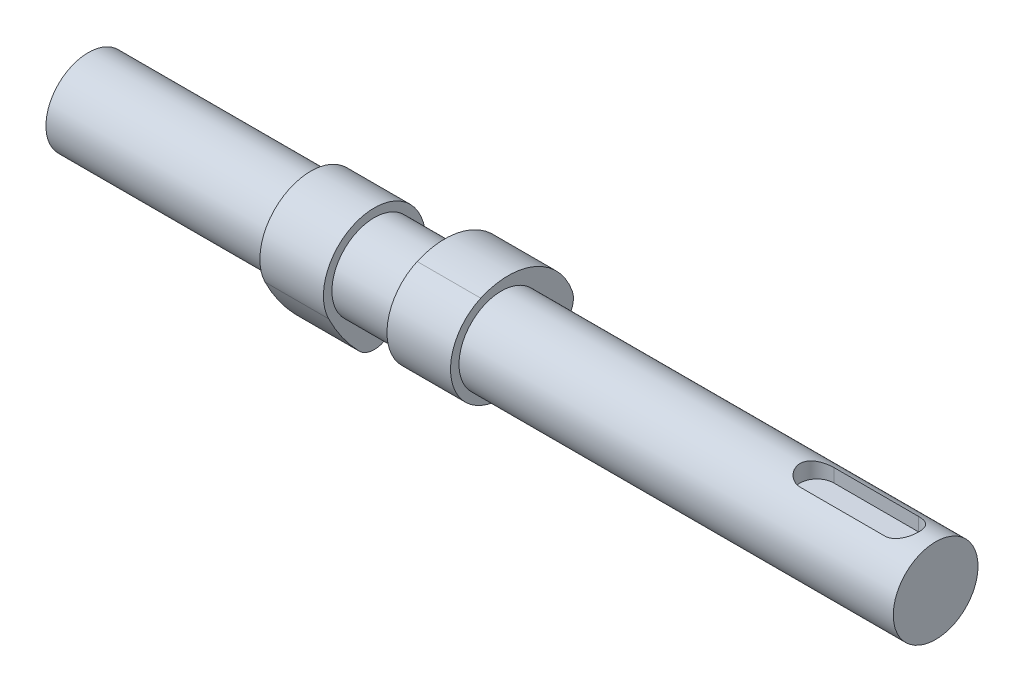
ISO-10303-21;
HEADER;
FILE_DESCRIPTION(('STEP AP214'),'2;1');
FILE_NAME('part.step','',(''),(''),'','','');
FILE_SCHEMA(('AUTOMOTIVE_DESIGN { 1 0 10303 214 1 1 1 1 }'));
ENDSEC;
DATA;
#1=APPLICATION_CONTEXT('core data for automotive mechanical design processes');
#2=APPLICATION_PROTOCOL_DEFINITION('international standard','automotive_design',2000,#1);
#3=PRODUCT_CONTEXT('',#1,'mechanical');
#4=PRODUCT('Part','Part','',(#3));
#5=PRODUCT_RELATED_PRODUCT_CATEGORY('part','',(#4));
#6=PRODUCT_DEFINITION_FORMATION('','',#4);
#7=PRODUCT_DEFINITION_CONTEXT('part definition',#1,'design');
#8=PRODUCT_DEFINITION('design','',#6,#7);
#9=PRODUCT_DEFINITION_SHAPE('','',#8);
#10=(LENGTH_UNIT() NAMED_UNIT(*) SI_UNIT(.MILLI.,.METRE.));
#11=(NAMED_UNIT(*) PLANE_ANGLE_UNIT() SI_UNIT($,.RADIAN.));
#12=(NAMED_UNIT(*) SI_UNIT($,.STERADIAN.) SOLID_ANGLE_UNIT());
#13=UNCERTAINTY_MEASURE_WITH_UNIT(LENGTH_MEASURE(1.E-05),#10,'distance_accuracy_value','');
#14=(GEOMETRIC_REPRESENTATION_CONTEXT(3) GLOBAL_UNCERTAINTY_ASSIGNED_CONTEXT((#13)) GLOBAL_UNIT_ASSIGNED_CONTEXT((#10,
#11,#12)) REPRESENTATION_CONTEXT('',''));
#15=CARTESIAN_POINT('',(0.,0.,0.));
#16=DIRECTION('',(0.,0.,1.));
#17=DIRECTION('',(1.,0.,0.));
#18=AXIS2_PLACEMENT_3D('',#15,#16,#17);
#19=CARTESIAN_POINT('',(-22.5,-1.62236318948023,3.65621904177246));
#20=DIRECTION('',(1.,0.,0.));
#21=DIRECTION('',(0.,1.,0.));
#22=AXIS2_PLACEMENT_3D('',#19,#20,#21);
#23=CYLINDRICAL_SURFACE('',#22,16.);
#24=CARTESIAN_POINT('',(-7.5,-1.62236318948023,3.65621904177246));
#25=DIRECTION('',(1.,0.,0.));
#26=DIRECTION('',(0.,1.,0.));
#27=AXIS2_PLACEMENT_3D('',#24,#25,#26);
#28=CIRCLE('',#27,16.);
#29=CARTESIAN_POINT('',(-7.5,-16.7126720366766,-1.66191774626015));
#30=VERTEX_POINT('',#29);
#31=CARTESIAN_POINT('',(-7.5,4.86708956844069,-10.9686571253174));
#32=VERTEX_POINT('',#31);
#33=EDGE_CURVE('E113',#30,#32,#28,.T.);
#34=ORIENTED_EDGE('',*,*,#33,.F.);
#35=DIRECTION('',(1.,0.,0.));
#36=VECTOR('',#35,1.);
#37=CARTESIAN_POINT('',(-22.5,-16.7126720366766,-1.66191774626015));
#38=LINE('',#37,#36);
#39=CARTESIAN_POINT('',(-22.5,-16.7126720366766,-1.66191774626015));
#40=VERTEX_POINT('',#39);
#41=EDGE_CURVE('E112',#40,#30,#38,.T.);
#42=ORIENTED_EDGE('',*,*,#41,.F.);
#43=CARTESIAN_POINT('',(-22.5,-1.62236318948023,3.65621904177246));
#44=DIRECTION('',(1.,0.,0.));
#45=DIRECTION('',(0.,1.,0.));
#46=AXIS2_PLACEMENT_3D('',#43,#44,#45);
#47=CIRCLE('',#46,16.);
#48=CARTESIAN_POINT('',(-22.5,4.86708956844069,-10.9686571253174));
#49=VERTEX_POINT('',#48);
#50=EDGE_CURVE('E107',#40,#49,#47,.T.);
#51=ORIENTED_EDGE('',*,*,#50,.T.);
#52=DIRECTION('',(1.,0.,0.));
#53=VECTOR('',#52,1.);
#54=CARTESIAN_POINT('',(-22.5,4.86708956844069,-10.9686571253174));
#55=LINE('',#54,#53);
#56=EDGE_CURVE('E12',#49,#32,#55,.T.);
#57=ORIENTED_EDGE('',*,*,#56,.T.);
#58=EDGE_LOOP('',(#34,#42,#51,#57));
#59=FACE_BOUND('',#58,.T.);
#60=ADVANCED_FACE('F50',(#59),#23,.T.);
#61=CARTESIAN_POINT('',(-22.5,0.,0.));
#62=DIRECTION('',(1.,0.,0.));
#63=DIRECTION('',(0.,1.,0.));
#64=AXIS2_PLACEMENT_3D('',#61,#62,#63);
#65=CYLINDRICAL_SURFACE('',#64,12.);
#66=CARTESIAN_POINT('',(-7.5,0.,0.));
#67=DIRECTION('',(1.,0.,0.));
#68=DIRECTION('',(0.,-1.,0.));
#69=AXIS2_PLACEMENT_3D('',#66,#67,#68);
#70=CIRCLE('',#69,12.);
#71=CARTESIAN_POINT('',(-7.5,-5.30622661682886,10.7630831591537));
#72=VERTEX_POINT('',#71);
#73=EDGE_CURVE('E115',#32,#72,#70,.T.);
#74=ORIENTED_EDGE('',*,*,#73,.F.);
#75=ORIENTED_EDGE('',*,*,#56,.F.);
#76=CARTESIAN_POINT('',(-22.5,0.,0.));
#77=DIRECTION('',(1.,0.,0.));
#78=DIRECTION('',(0.,-1.,0.));
#79=AXIS2_PLACEMENT_3D('',#76,#77,#78);
#80=CIRCLE('',#79,12.);
#81=CARTESIAN_POINT('',(-22.5,-5.30622661682886,10.7630831591537));
#82=VERTEX_POINT('',#81);
#83=EDGE_CURVE('E91',#49,#82,#80,.T.);
#84=ORIENTED_EDGE('',*,*,#83,.T.);
#85=DIRECTION('',(1.,0.,0.));
#86=VECTOR('',#85,1.);
#87=CARTESIAN_POINT('',(-22.5,-5.30622661682886,10.7630831591537));
#88=LINE('',#87,#86);
#89=EDGE_CURVE('E58',#82,#72,#88,.T.);
#90=ORIENTED_EDGE('',*,*,#89,.T.);
#91=EDGE_LOOP('',(#74,#75,#84,#90));
#92=FACE_BOUND('',#91,.T.);
#93=ADVANCED_FACE('F105',(#92),#65,.T.);
#94=CARTESIAN_POINT('',(-22.5,12.3811954392673,-25.1138607046919));
#95=DIRECTION('',(1.,0.,0.));
#96=DIRECTION('',(0.,1.,0.));
#97=AXIS2_PLACEMENT_3D('',#94,#95,#96);
#98=CYLINDRICAL_SURFACE('',#97,40.);
#99=CARTESIAN_POINT('',(-7.5,12.3811954392673,-25.1138607046919));
#100=DIRECTION('',(1.,0.,0.));
#101=DIRECTION('',(0.,-1.,0.));
#102=AXIS2_PLACEMENT_3D('',#99,#100,#101);
#103=CIRCLE('',#102,40.);
#104=CARTESIAN_POINT('',(-7.5,-15.4795428020985,3.5876943863846));
#105=VERTEX_POINT('',#104);
#106=EDGE_CURVE('E101',#72,#105,#103,.T.);
#107=ORIENTED_EDGE('',*,*,#106,.F.);
#108=ORIENTED_EDGE('',*,*,#89,.F.);
#109=CARTESIAN_POINT('',(-22.5,12.3811954392673,-25.1138607046919));
#110=DIRECTION('',(1.,0.,0.));
#111=DIRECTION('',(0.,-1.,0.));
#112=AXIS2_PLACEMENT_3D('',#109,#110,#111);
#113=CIRCLE('',#112,40.);
#114=CARTESIAN_POINT('',(-22.5,-15.4795428020985,3.5876943863846));
#115=VERTEX_POINT('',#114);
#116=EDGE_CURVE('E94',#82,#115,#113,.T.);
#117=ORIENTED_EDGE('',*,*,#116,.T.);
#118=DIRECTION('',(1.,0.,0.));
#119=VECTOR('',#118,1.);
#120=CARTESIAN_POINT('',(-22.5,-15.4795428020985,3.5876943863846));
#121=LINE('',#120,#119);
#122=EDGE_CURVE('E104',#115,#105,#121,.T.);
#123=ORIENTED_EDGE('',*,*,#122,.T.);
#124=EDGE_LOOP('',(#107,#108,#117,#123));
#125=FACE_BOUND('',#124,.T.);
#126=ADVANCED_FACE('F100',(#125),#98,.T.);
#127=CARTESIAN_POINT('',(-22.5,-11.9969505219278,0.));
#128=DIRECTION('',(1.,0.,0.));
#129=DIRECTION('',(0.,1.,0.));
#130=AXIS2_PLACEMENT_3D('',#127,#128,#129);
#131=CYLINDRICAL_SURFACE('',#130,5.);
#132=CARTESIAN_POINT('',(-7.5,-11.9969505219278,0.));
#133=DIRECTION('',(1.,0.,0.));
#134=DIRECTION('',(0.,-1.,0.));
#135=AXIS2_PLACEMENT_3D('',#132,#133,#134);
#136=CIRCLE('',#135,5.);
#137=EDGE_CURVE('E80',#105,#30,#136,.T.);
#138=ORIENTED_EDGE('',*,*,#137,.F.);
#139=ORIENTED_EDGE('',*,*,#122,.F.);
#140=CARTESIAN_POINT('',(-22.5,-11.9969505219278,0.));
#141=DIRECTION('',(1.,0.,0.));
#142=DIRECTION('',(0.,-1.,0.));
#143=AXIS2_PLACEMENT_3D('',#140,#141,#142);
#144=CIRCLE('',#143,5.);
#145=EDGE_CURVE('E66',#115,#40,#144,.T.);
#146=ORIENTED_EDGE('',*,*,#145,.T.);
#147=ORIENTED_EDGE('',*,*,#41,.T.);
#148=EDGE_LOOP('',(#138,#139,#146,#147));
#149=FACE_BOUND('',#148,.T.);
#150=ADVANCED_FACE('F124',(#149),#131,.T.);
#151=CARTESIAN_POINT('',(-22.5,-6.809656855704,1.82810952088625));
#152=DIRECTION('',(1.,0.,0.));
#153=DIRECTION('',(0.,1.,0.));
#154=AXIS2_PLACEMENT_3D('',#151,#152,#153);
#155=PLANE('',#154);
#156=ORIENTED_EDGE('',*,*,#50,.F.);
#157=ORIENTED_EDGE('',*,*,#145,.F.);
#158=ORIENTED_EDGE('',*,*,#116,.F.);
#159=ORIENTED_EDGE('',*,*,#83,.F.);
#160=EDGE_LOOP('',(#156,#157,#158,#159));
#161=FACE_BOUND('',#160,.T.);
#162=ADVANCED_FACE('F96',(#161),#155,.F.);
#163=CARTESIAN_POINT('',(-7.5,-6.809656855704,1.82810952088625));
#164=DIRECTION('',(1.,0.,0.));
#165=DIRECTION('',(0.,1.,0.));
#166=AXIS2_PLACEMENT_3D('',#163,#164,#165);
#167=PLANE('',#166);
#168=ORIENTED_EDGE('',*,*,#33,.T.);
#169=ORIENTED_EDGE('',*,*,#73,.T.);
#170=ORIENTED_EDGE('',*,*,#106,.T.);
#171=ORIENTED_EDGE('',*,*,#137,.T.);
#172=EDGE_LOOP('',(#168,#169,#170,#171));
#173=FACE_BOUND('',#172,.T.);
#174=ADVANCED_FACE('F120',(#173),#167,.T.);
#175=CLOSED_SHELL('',(#60,#93,#126,#150,#162,#174));
#176=MANIFOLD_SOLID_BREP('B2',#175);
#177=CARTESIAN_POINT('',(22.5,-3.65621904177245,-1.62236318948024));
#178=DIRECTION('',(-1.,0.,0.));
#179=DIRECTION('',(0.,0.,1.));
#180=AXIS2_PLACEMENT_3D('',#177,#178,#179);
#181=CYLINDRICAL_SURFACE('',#180,16.);
#182=CARTESIAN_POINT('',(7.5,-3.65621904177245,-1.62236318948024));
#183=DIRECTION('',(1.,0.,0.));
#184=DIRECTION('',(0.,0.,1.));
#185=AXIS2_PLACEMENT_3D('',#182,#183,#184);
#186=CIRCLE('',#185,16.);
#187=CARTESIAN_POINT('',(7.5,1.66191774626021,-16.7126720366766));
#188=VERTEX_POINT('',#187);
#189=CARTESIAN_POINT('',(7.5,10.9686571253174,4.86708956844073));
#190=VERTEX_POINT('',#189);
#191=EDGE_CURVE('E246',#188,#190,#186,.T.);
#192=ORIENTED_EDGE('',*,*,#191,.T.);
#193=DIRECTION('',(-1.,0.,0.));
#194=VECTOR('',#193,1.);
#195=CARTESIAN_POINT('',(22.5,10.9686571253174,4.86708956844073));
#196=LINE('',#195,#194);
#197=CARTESIAN_POINT('',(22.5,10.9686571253174,4.86708956844073));
#198=VERTEX_POINT('',#197);
#199=EDGE_CURVE('E48',#198,#190,#196,.T.);
#200=ORIENTED_EDGE('',*,*,#199,.F.);
#201=CARTESIAN_POINT('',(22.5,-3.65621904177245,-1.62236318948024));
#202=DIRECTION('',(1.,0.,0.));
#203=DIRECTION('',(0.,0.,1.));
#204=AXIS2_PLACEMENT_3D('',#201,#202,#203);
#205=CIRCLE('',#204,16.);
#206=CARTESIAN_POINT('',(22.5,1.66191774626021,-16.7126720366766));
#207=VERTEX_POINT('',#206);
#208=EDGE_CURVE('E234',#207,#198,#205,.T.);
#209=ORIENTED_EDGE('',*,*,#208,.F.);
#210=DIRECTION('',(-1.,0.,0.));
#211=VECTOR('',#210,1.);
#212=CARTESIAN_POINT('',(22.5,1.66191774626021,-16.7126720366766));
#213=LINE('',#212,#211);
#214=EDGE_CURVE('E242',#207,#188,#213,.T.);
#215=ORIENTED_EDGE('',*,*,#214,.T.);
#216=EDGE_LOOP('',(#192,#200,#209,#215));
#217=FACE_BOUND('',#216,.T.);
#218=ADVANCED_FACE('F183',(#217),#181,.T.);
#219=CARTESIAN_POINT('',(22.5,0.,0.));
#220=DIRECTION('',(-1.,0.,0.));
#221=DIRECTION('',(0.,0.,1.));
#222=AXIS2_PLACEMENT_3D('',#219,#220,#221);
#223=CYLINDRICAL_SURFACE('',#222,12.);
#224=CARTESIAN_POINT('',(7.5,0.,0.));
#225=DIRECTION('',(1.,0.,0.));
#226=DIRECTION('',(0.,0.,-1.));
#227=AXIS2_PLACEMENT_3D('',#224,#225,#226);
#228=CIRCLE('',#227,12.);
#229=CARTESIAN_POINT('',(7.5,-10.7630831591536,-5.30622661682889));
#230=VERTEX_POINT('',#229);
#231=EDGE_CURVE('E238',#190,#230,#228,.T.);
#232=ORIENTED_EDGE('',*,*,#231,.T.);
#233=DIRECTION('',(-1.,0.,0.));
#234=VECTOR('',#233,1.);
#235=CARTESIAN_POINT('',(22.5,-10.7630831591536,-5.30622661682889));
#236=LINE('',#235,#234);
#237=CARTESIAN_POINT('',(22.5,-10.7630831591536,-5.30622661682889));
#238=VERTEX_POINT('',#237);
#239=EDGE_CURVE('E191',#238,#230,#236,.T.);
#240=ORIENTED_EDGE('',*,*,#239,.F.);
#241=CARTESIAN_POINT('',(22.5,0.,0.));
#242=DIRECTION('',(1.,0.,0.));
#243=DIRECTION('',(0.,0.,-1.));
#244=AXIS2_PLACEMENT_3D('',#241,#242,#243);
#245=CIRCLE('',#244,12.);
#246=EDGE_CURVE('E229',#198,#238,#245,.T.);
#247=ORIENTED_EDGE('',*,*,#246,.F.);
#248=ORIENTED_EDGE('',*,*,#199,.T.);
#249=EDGE_LOOP('',(#232,#240,#247,#248));
#250=FACE_BOUND('',#249,.T.);
#251=ADVANCED_FACE('F237',(#250),#223,.T.);
#252=CARTESIAN_POINT('',(22.5,25.1138607046918,12.3811954392674));
#253=DIRECTION('',(-1.,0.,0.));
#254=DIRECTION('',(0.,0.,1.));
#255=AXIS2_PLACEMENT_3D('',#252,#253,#254);
#256=CYLINDRICAL_SURFACE('',#255,40.);
#257=CARTESIAN_POINT('',(7.5,25.1138607046918,12.3811954392674));
#258=DIRECTION('',(1.,0.,0.));
#259=DIRECTION('',(0.,0.,-1.));
#260=AXIS2_PLACEMENT_3D('',#257,#258,#259);
#261=CIRCLE('',#260,40.);
#262=CARTESIAN_POINT('',(7.5,-3.58769438638455,-15.4795428020985));
#263=VERTEX_POINT('',#262);
#264=EDGE_CURVE('E216',#230,#263,#261,.T.);
#265=ORIENTED_EDGE('',*,*,#264,.T.);
#266=DIRECTION('',(-1.,0.,0.));
#267=VECTOR('',#266,1.);
#268=CARTESIAN_POINT('',(22.5,-3.58769438638455,-15.4795428020985));
#269=LINE('',#268,#267);
#270=CARTESIAN_POINT('',(22.5,-3.58769438638455,-15.4795428020985));
#271=VERTEX_POINT('',#270);
#272=EDGE_CURVE('E239',#271,#263,#269,.T.);
#273=ORIENTED_EDGE('',*,*,#272,.F.);
#274=CARTESIAN_POINT('',(22.5,25.1138607046918,12.3811954392674));
#275=DIRECTION('',(1.,0.,0.));
#276=DIRECTION('',(0.,0.,-1.));
#277=AXIS2_PLACEMENT_3D('',#274,#275,#276);
#278=CIRCLE('',#277,40.);
#279=EDGE_CURVE('E232',#238,#271,#278,.T.);
#280=ORIENTED_EDGE('',*,*,#279,.F.);
#281=ORIENTED_EDGE('',*,*,#239,.T.);
#282=EDGE_LOOP('',(#265,#273,#280,#281));
#283=FACE_BOUND('',#282,.T.);
#284=ADVANCED_FACE('F240',(#283),#256,.T.);
#285=CARTESIAN_POINT('',(22.5,0.,-11.9969505219278));
#286=DIRECTION('',(-1.,0.,0.));
#287=DIRECTION('',(0.,0.,1.));
#288=AXIS2_PLACEMENT_3D('',#285,#286,#287);
#289=CYLINDRICAL_SURFACE('',#288,5.);
#290=CARTESIAN_POINT('',(7.5,0.,-11.9969505219278));
#291=DIRECTION('',(1.,0.,0.));
#292=DIRECTION('',(0.,0.,-1.));
#293=AXIS2_PLACEMENT_3D('',#290,#291,#292);
#294=CIRCLE('',#293,5.);
#295=EDGE_CURVE('E222',#263,#188,#294,.T.);
#296=ORIENTED_EDGE('',*,*,#295,.T.);
#297=ORIENTED_EDGE('',*,*,#214,.F.);
#298=CARTESIAN_POINT('',(22.5,0.,-11.9969505219278));
#299=DIRECTION('',(1.,0.,0.));
#300=DIRECTION('',(0.,0.,-1.));
#301=AXIS2_PLACEMENT_3D('',#298,#299,#300);
#302=CIRCLE('',#301,5.);
#303=EDGE_CURVE('E199',#271,#207,#302,.T.);
#304=ORIENTED_EDGE('',*,*,#303,.F.);
#305=ORIENTED_EDGE('',*,*,#272,.T.);
#306=EDGE_LOOP('',(#296,#297,#304,#305));
#307=FACE_BOUND('',#306,.T.);
#308=ADVANCED_FACE('F253',(#307),#289,.T.);
#309=CARTESIAN_POINT('',(22.5,-1.82810952088623,-6.809656855704));
#310=DIRECTION('',(-1.,0.,0.));
#311=DIRECTION('',(0.,0.,1.));
#312=AXIS2_PLACEMENT_3D('',#309,#310,#311);
#313=PLANE('',#312);
#314=ORIENTED_EDGE('',*,*,#208,.T.);
#315=ORIENTED_EDGE('',*,*,#246,.T.);
#316=ORIENTED_EDGE('',*,*,#279,.T.);
#317=ORIENTED_EDGE('',*,*,#303,.T.);
#318=EDGE_LOOP('',(#314,#315,#316,#317));
#319=FACE_BOUND('',#318,.T.);
#320=ADVANCED_FACE('F230',(#319),#313,.F.);
#321=CARTESIAN_POINT('',(7.5,-1.82810952088623,-6.809656855704));
#322=DIRECTION('',(-1.,0.,0.));
#323=DIRECTION('',(0.,0.,1.));
#324=AXIS2_PLACEMENT_3D('',#321,#322,#323);
#325=PLANE('',#324);
#326=ORIENTED_EDGE('',*,*,#191,.F.);
#327=ORIENTED_EDGE('',*,*,#295,.F.);
#328=ORIENTED_EDGE('',*,*,#264,.F.);
#329=ORIENTED_EDGE('',*,*,#231,.F.);
#330=EDGE_LOOP('',(#326,#327,#328,#329));
#331=FACE_BOUND('',#330,.T.);
#332=ADVANCED_FACE('F256',(#331),#325,.T.);
#333=CLOSED_SHELL('',(#218,#251,#284,#308,#320,#332));
#334=MANIFOLD_SOLID_BREP('B6',#333);
#335=CARTESIAN_POINT('',(125.,0.,0.));
#336=DIRECTION('',(-1.,0.,0.));
#337=DIRECTION('',(0.,0.,1.));
#338=AXIS2_PLACEMENT_3D('',#335,#336,#337);
#339=CYLINDRICAL_SURFACE('',#338,10.);
#340=DIRECTION('',(-1.,0.,0.));
#341=VECTOR('',#340,1.);
#342=CARTESIAN_POINT('',(125.,9.16515138991169,-3.99999999999998));
#343=LINE('',#342,#341);
#344=CARTESIAN_POINT('',(97.,9.16515138991169,-3.99999999999999));
#345=VERTEX_POINT('',#344);
#346=CARTESIAN_POINT('',(117.,9.16515138991169,-3.99999999999998));
#347=VERTEX_POINT('',#346);
#348=EDGE_CURVE('E181',#345,#347,#343,.F.);
#349=ORIENTED_EDGE('',*,*,#348,.T.);
#350=CARTESIAN_POINT('',(117.,9.16515138991168,-3.99999999999999));
#351=CARTESIAN_POINT('',(117.107611705054,9.16512928809545,-4.00001596071936));
#352=CARTESIAN_POINT('',(117.215211331167,9.16704612011429,-3.99565782731265));
#353=CARTESIAN_POINT('',(117.429542596539,9.17459250745478,-3.97831811946459));
#354=CARTESIAN_POINT('',(117.536274550717,9.18022064873058,-3.9653398293753));
#355=CARTESIAN_POINT('',(117.747693643106,9.19499565865172,-3.93095207352898));
#356=CARTESIAN_POINT('',(117.852387168085,9.20412861441611,-3.90957593640915));
#357=CARTESIAN_POINT('',(118.059401543432,9.22560106586819,-3.85863260381272));
#358=CARTESIAN_POINT('',(118.161722248555,9.23794075728509,-3.82906490834147));
#359=CARTESIAN_POINT('',(118.463871701162,9.2791858250141,-3.72853943587111));
#360=CARTESIAN_POINT('',(118.659308461383,9.3123489831615,-3.64568978920221));
#361=CARTESIAN_POINT('',(119.033591160162,9.3862474152947,-3.45096383184146));
#362=CARTESIAN_POINT('',(119.212421105909,9.42698987727426,-3.33905992673094));
#363=CARTESIAN_POINT('',(119.558524793364,9.51401998804847,-3.08263671474506));
#364=CARTESIAN_POINT('',(119.7247344339,9.56048491272144,-2.936738279885));
#365=CARTESIAN_POINT('',(120.031080544361,9.65225581096199,-2.61939292349377));
#366=CARTESIAN_POINT('',(120.171211661507,9.69756154495612,-2.44794076987997));
#367=CARTESIAN_POINT('',(120.426812788624,9.78406834216145,-2.07601181629753));
#368=CARTESIAN_POINT('',(120.54108961941,9.82503649102096,-1.87465586655102));
#369=CARTESIAN_POINT('',(120.733688144491,9.89607888234979,-1.45364828604453));
#370=CARTESIAN_POINT('',(120.812024844793,9.92615767032247,-1.23400433637531));
#371=CARTESIAN_POINT('',(120.926682405771,9.97076629361036,-0.793934884187369));
#372=CARTESIAN_POINT('',(120.964853913303,9.98597845290694,-0.57406211486902));
#373=CARTESIAN_POINT('',(121.004056948403,10.001606202074,-0.130536855092202));
#374=CARTESIAN_POINT('',(121.005101633252,10.0020270338048,0.0931142682526811));
#375=CARTESIAN_POINT('',(120.971034362072,9.98843920775428,0.524466731987233));
#376=CARTESIAN_POINT('',(120.937950053447,9.97523973659777,0.732358330632753));
#377=CARTESIAN_POINT('',(120.84001299909,9.93698538393897,1.13934964738689));
#378=CARTESIAN_POINT('',(120.77515845543,9.91192983148495,1.33844886722559));
#379=CARTESIAN_POINT('',(120.614727962228,9.85193670608706,1.72579479688349));
#380=CARTESIAN_POINT('',(120.518703604161,9.81685584875391,1.91383264586892));
#381=CARTESIAN_POINT('',(120.299068736295,9.74029168639969,2.27161599563071));
#382=CARTESIAN_POINT('',(120.175448548562,9.69880613681324,2.4413550479227));
#383=CARTESIAN_POINT('',(119.894719942564,9.61043706268122,2.7695225783069));
#384=CARTESIAN_POINT('',(119.735946982884,9.56337795745419,2.92647922614482));
#385=CARTESIAN_POINT('',(119.394007863337,9.47123359153046,3.21221470862619));
#386=CARTESIAN_POINT('',(119.2108306512,9.42614923753061,3.34098070594789));
#387=CARTESIAN_POINT('',(118.918364354377,9.36326134539255,3.51186134851388));
#388=CARTESIAN_POINT('',(118.816328161685,9.34283170142195,3.56571263251515));
#389=CARTESIAN_POINT('',(118.607607697591,9.30450957703985,3.66454761505658));
#390=CARTESIAN_POINT('',(118.500925454273,9.28661600381594,3.70953513634085));
#391=CARTESIAN_POINT('',(118.283771069504,9.25400250539921,3.79016254319006));
#392=CARTESIAN_POINT('',(118.173303829959,9.23927864276951,3.82581403809398));
#393=CARTESIAN_POINT('',(117.949331631851,9.2135146773091,3.88744848158463));
#394=CARTESIAN_POINT('',(117.835828059787,9.20247292309662,3.91343576505911));
#395=CARTESIAN_POINT('',(117.602554552662,9.18417798205495,3.95619393609845));
#396=CARTESIAN_POINT('',(117.482705805436,9.17707470750587,3.97260125584169));
#397=CARTESIAN_POINT('',(117.241909070863,9.16754485606458,3.99451448409732));
#398=CARTESIAN_POINT('',(117.120961807077,9.16511539745838,4.0000271099601));
#399=CARTESIAN_POINT('',(117.,9.16515138991168,3.99999999999999));
#400=B_SPLINE_CURVE_WITH_KNOTS('',3,(#350,#351,#352,#353,#354,#355,#356,#357,#358,#359,#360,
#361,#362,#363,#364,#365,#366,#367,#368,#369,#370,#371,#372,#373,#374,#375,#376,#377,#378,#379,
#380,#381,#382,#383,#384,#385,#386,#387,#388,#389,#390,#391,#392,#393,#394,#395,#396,#397,#398,
#399),.UNSPECIFIED.,.F.,.F.,(4,2,2,2,2,2,2,2,2,2,2,2,2,2,2,2,2,2,2,2,2,2,2,2,4),(0.,
0.322709706217834,0.645296527806424,0.966615822543774,1.28795473422461,1.92936600351818,
2.5713886988925,3.24636095994994,3.92147161082381,4.62325717855526,5.32474946398644,
5.99227753012538,6.6595690303331,7.28937830523069,7.91922322615307,8.55856353859092,
9.19812842270036,9.87963749353242,10.5614562641081,10.9125878460838,11.2635676597187,
11.6141089352909,11.964492785171,12.3274303244848,12.6901440171997),.UNSPECIFIED.);
#401=CARTESIAN_POINT('',(117.,9.16515138991168,3.99999999999999));
#402=VERTEX_POINT('',#401);
#403=EDGE_CURVE('E382',#347,#402,#400,.T.);
#404=ORIENTED_EDGE('',*,*,#403,.T.);
#405=DIRECTION('',(-1.,0.,0.));
#406=VECTOR('',#405,1.);
#407=CARTESIAN_POINT('',(125.,9.16515138991168,4.00000000000001));
#408=LINE('',#407,#406);
#409=CARTESIAN_POINT('',(97.,9.16515138991168,4.00000000000001));
#410=VERTEX_POINT('',#409);
#411=EDGE_CURVE('E315',#402,#410,#408,.T.);
#412=ORIENTED_EDGE('',*,*,#411,.T.);
#413=CARTESIAN_POINT('',(97.,9.16515138991169,3.99999999999999));
#414=CARTESIAN_POINT('',(96.8923882949458,9.16512928809545,4.00001596071936));
#415=CARTESIAN_POINT('',(96.7847886688333,9.16704612011429,3.99565782731264));
#416=CARTESIAN_POINT('',(96.5704574034612,9.17459250745479,3.97831811946458));
#417=CARTESIAN_POINT('',(96.4637254492831,9.18022064873059,3.96533982937529));
#418=CARTESIAN_POINT('',(96.2523063568937,9.19499565865172,3.93095207352898));
#419=CARTESIAN_POINT('',(96.1476128319149,9.20412861441612,3.90957593640914));
#420=CARTESIAN_POINT('',(95.940598456568,9.22560106586819,3.85863260381271));
#421=CARTESIAN_POINT('',(95.8382777514449,9.23794075728509,3.82906490834146));
#422=CARTESIAN_POINT('',(95.5361282988375,9.27918582501411,3.7285394358711));
#423=CARTESIAN_POINT('',(95.3406915386172,9.31234898316151,3.6456897892022));
#424=CARTESIAN_POINT('',(94.9664088398381,9.3862474152947,3.45096383184145));
#425=CARTESIAN_POINT('',(94.7875788940914,9.42698987727426,3.33905992673092));
#426=CARTESIAN_POINT('',(94.441475206636,9.51401998804847,3.08263671474505));
#427=CARTESIAN_POINT('',(94.2752655660996,9.56048491272144,2.93673827988499));
#428=CARTESIAN_POINT('',(93.9689194556385,9.652255810962,2.61939292349376));
#429=CARTESIAN_POINT('',(93.8287883384928,9.69756154495613,2.44794076987996));
#430=CARTESIAN_POINT('',(93.5731872113755,9.78406834216145,2.07601181629751));
#431=CARTESIAN_POINT('',(93.4589103805898,9.82503649102096,1.874655866551));
#432=CARTESIAN_POINT('',(93.2663118555086,9.89607888234979,1.4536482860445));
#433=CARTESIAN_POINT('',(93.1879751552067,9.92615767032247,1.23400433637529));
#434=CARTESIAN_POINT('',(93.0733175942291,9.97076629361036,0.793934884187351));
#435=CARTESIAN_POINT('',(93.0351460866969,9.98597845290694,0.574062114869002));
#436=CARTESIAN_POINT('',(92.9959430515965,10.001606202074,0.130536855092185));
#437=CARTESIAN_POINT('',(92.9948983667482,10.0020270338048,-0.0931142682526963));
#438=CARTESIAN_POINT('',(93.0289656379282,9.98843920775428,-0.524466731987249));
#439=CARTESIAN_POINT('',(93.0620499465532,9.97523973659777,-0.73235833063277));
#440=CARTESIAN_POINT('',(93.1599870009102,9.93698538393897,-1.1393496473869));
#441=CARTESIAN_POINT('',(93.2248415445704,9.91192983148495,-1.3384488672256));
#442=CARTESIAN_POINT('',(93.385272037772,9.85193670608706,-1.7257947968835));
#443=CARTESIAN_POINT('',(93.4812963958391,9.81685584875391,-1.91383264586892));
#444=CARTESIAN_POINT('',(93.7009312637048,9.74029168639969,-2.27161599563071));
#445=CARTESIAN_POINT('',(93.8245514514379,9.69880613681324,-2.44135504792271));
#446=CARTESIAN_POINT('',(94.1052800574364,9.61043706268122,-2.76952257830691));
#447=CARTESIAN_POINT('',(94.2640530171164,9.56337795745419,-2.92647922614484));
#448=CARTESIAN_POINT('',(94.6059921366628,9.47123359153046,-3.21221470862621));
#449=CARTESIAN_POINT('',(94.7891693487996,9.42614923753061,-3.3409807059479));
#450=CARTESIAN_POINT('',(95.0816356456234,9.36326134539254,-3.5118613485139));
#451=CARTESIAN_POINT('',(95.1836718383149,9.34283170142194,-3.56571263251516));
#452=CARTESIAN_POINT('',(95.3923923024092,9.30450957703984,-3.6645476150566));
#453=CARTESIAN_POINT('',(95.4990745457273,9.28661600381593,-3.70953513634087));
#454=CARTESIAN_POINT('',(95.7162289304963,9.2540025053992,-3.79016254319008));
#455=CARTESIAN_POINT('',(95.8266961700414,9.2392786427695,-3.82581403809399));
#456=CARTESIAN_POINT('',(96.0506683681487,9.2135146773091,-3.88744848158464));
#457=CARTESIAN_POINT('',(96.1641719402126,9.20247292309662,-3.91343576505912));
#458=CARTESIAN_POINT('',(96.3974454473375,9.18417798205495,-3.95619393609845));
#459=CARTESIAN_POINT('',(96.5172941945638,9.17707470750587,-3.9726012558417));
#460=CARTESIAN_POINT('',(96.758090929137,9.16754485606458,-3.99451448409732));
#461=CARTESIAN_POINT('',(96.8790381929227,9.16511539745838,-4.0000271099601));
#462=CARTESIAN_POINT('',(97.,9.16515138991168,-4.));
#463=B_SPLINE_CURVE_WITH_KNOTS('',3,(#413,#414,#415,#416,#417,#418,#419,#420,#421,#422,#423,
#424,#425,#426,#427,#428,#429,#430,#431,#432,#433,#434,#435,#436,#437,#438,#439,#440,#441,#442,
#443,#444,#445,#446,#447,#448,#449,#450,#451,#452,#453,#454,#455,#456,#457,#458,#459,#460,#461,
#462),.UNSPECIFIED.,.F.,.F.,(4,2,2,2,2,2,2,2,2,2,2,2,2,2,2,2,2,2,2,2,2,2,2,2,4),(0.,
0.322709706217834,0.645296527806424,0.966615822543789,1.28795473422461,1.92936600351818,
2.5713886988925,3.24636095994994,3.92147161082382,4.62325717855526,5.32474946398644,
5.99227753012538,6.6595690303331,7.28937830523069,7.91922322615307,8.55856353859091,
9.19812842270035,9.87963749353242,10.5614562641081,10.9125878460839,11.2635676597187,
11.6141089352909,11.964492785171,12.3274303244847,12.6901440171997),.UNSPECIFIED.);
#464=EDGE_CURVE('E322',#410,#345,#463,.T.);
#465=ORIENTED_EDGE('',*,*,#464,.T.);
#466=EDGE_LOOP('',(#349,#404,#412,#465));
#467=FACE_BOUND('',#466,.T.);
#468=CARTESIAN_POINT('',(125.,0.,0.));
#469=DIRECTION('',(1.,0.,0.));
#470=DIRECTION('',(0.,0.,-1.));
#471=AXIS2_PLACEMENT_3D('',#468,#469,#470);
#472=CIRCLE('',#471,10.);
#473=CARTESIAN_POINT('',(125.,0.,-10.));
#474=VERTEX_POINT('',#473);
#475=EDGE_CURVE('E379',#474,#474,#472,.T.);
#476=ORIENTED_EDGE('',*,*,#475,.F.);
#477=EDGE_LOOP('',(#476));
#478=FACE_BOUND('',#477,.T.);
#479=CARTESIAN_POINT('',(-75.,0.,0.));
#480=DIRECTION('',(1.,0.,0.));
#481=DIRECTION('',(0.,0.,-1.));
#482=AXIS2_PLACEMENT_3D('',#479,#480,#481);
#483=CIRCLE('',#482,10.);
#484=CARTESIAN_POINT('',(-75.,0.,-10.));
#485=VERTEX_POINT('',#484);
#486=EDGE_CURVE('E373',#485,#485,#483,.T.);
#487=ORIENTED_EDGE('',*,*,#486,.T.);
#488=EDGE_LOOP('',(#487));
#489=FACE_BOUND('',#488,.T.);
#490=ADVANCED_FACE('F307',(#467,#478,#489),#339,.T.);
#491=CARTESIAN_POINT('',(125.,0.,0.));
#492=DIRECTION('',(1.,0.,0.));
#493=DIRECTION('',(0.,0.,-1.));
#494=AXIS2_PLACEMENT_3D('',#491,#492,#493);
#495=PLANE('',#494);
#496=ORIENTED_EDGE('',*,*,#475,.T.);
#497=EDGE_LOOP('',(#496));
#498=FACE_BOUND('',#497,.T.);
#499=ADVANCED_FACE('F409',(#498),#495,.T.);
#500=CARTESIAN_POINT('',(-75.,0.,0.));
#501=DIRECTION('',(1.,0.,0.));
#502=DIRECTION('',(0.,0.,-1.));
#503=AXIS2_PLACEMENT_3D('',#500,#501,#502);
#504=PLANE('',#503);
#505=ORIENTED_EDGE('',*,*,#486,.F.);
#506=EDGE_LOOP('',(#505));
#507=FACE_BOUND('',#506,.T.);
#508=ADVANCED_FACE('F407',(#507),#504,.F.);
#509=CARTESIAN_POINT('',(97.,6.,0.));
#510=DIRECTION('',(0.,1.,0.));
#511=DIRECTION('',(0.,0.,1.));
#512=AXIS2_PLACEMENT_3D('',#509,#510,#511);
#513=CYLINDRICAL_SURFACE('',#512,3.99999999999999);
#514=DIRECTION('',(0.,1.,0.));
#515=VECTOR('',#514,1.);
#516=CARTESIAN_POINT('',(97.,6.,4.));
#517=LINE('',#516,#515);
#518=CARTESIAN_POINT('',(97.,6.,4.));
#519=VERTEX_POINT('',#518);
#520=EDGE_CURVE('E345',#519,#410,#517,.T.);
#521=ORIENTED_EDGE('',*,*,#520,.F.);
#522=CARTESIAN_POINT('',(97.,6.,0.));
#523=DIRECTION('',(0.,1.,0.));
#524=DIRECTION('',(0.,0.,1.));
#525=AXIS2_PLACEMENT_3D('',#522,#523,#524);
#526=CIRCLE('',#525,3.99999999999999);
#527=CARTESIAN_POINT('',(97.,6.,-3.99999999999999));
#528=VERTEX_POINT('',#527);
#529=EDGE_CURVE('E349',#528,#519,#526,.T.);
#530=ORIENTED_EDGE('',*,*,#529,.F.);
#531=DIRECTION('',(0.,1.,0.));
#532=VECTOR('',#531,1.);
#533=CARTESIAN_POINT('',(97.,6.,-3.99999999999999));
#534=LINE('',#533,#532);
#535=EDGE_CURVE('E371',#528,#345,#534,.T.);
#536=ORIENTED_EDGE('',*,*,#535,.T.);
#537=ORIENTED_EDGE('',*,*,#464,.F.);
#538=EDGE_LOOP('',(#521,#530,#536,#537));
#539=FACE_BOUND('',#538,.T.);
#540=ADVANCED_FACE('F347',(#539),#513,.F.);
#541=CARTESIAN_POINT('',(97.,6.,-3.99999999999999));
#542=DIRECTION('',(0.,0.,-1.));
#543=DIRECTION('',(-1.,0.,0.));
#544=AXIS2_PLACEMENT_3D('',#541,#542,#543);
#545=PLANE('',#544);
#546=ORIENTED_EDGE('',*,*,#535,.F.);
#547=DIRECTION('',(-1.,0.,0.));
#548=VECTOR('',#547,1.);
#549=CARTESIAN_POINT('',(97.,6.,-3.99999999999999));
#550=LINE('',#549,#548);
#551=CARTESIAN_POINT('',(117.,6.,-3.99999999999998));
#552=VERTEX_POINT('',#551);
#553=EDGE_CURVE('E354',#552,#528,#550,.T.);
#554=ORIENTED_EDGE('',*,*,#553,.F.);
#555=DIRECTION('',(0.,1.,0.));
#556=VECTOR('',#555,1.);
#557=CARTESIAN_POINT('',(117.,6.,-3.99999999999998));
#558=LINE('',#557,#556);
#559=EDGE_CURVE('E374',#552,#347,#558,.T.);
#560=ORIENTED_EDGE('',*,*,#559,.T.);
#561=ORIENTED_EDGE('',*,*,#348,.F.);
#562=EDGE_LOOP('',(#546,#554,#560,#561));
#563=FACE_BOUND('',#562,.T.);
#564=ADVANCED_FACE('F400',(#563),#545,.F.);
#565=CARTESIAN_POINT('',(117.,6.,0.));
#566=DIRECTION('',(0.,1.,0.));
#567=DIRECTION('',(0.,0.,1.));
#568=AXIS2_PLACEMENT_3D('',#565,#566,#567);
#569=CYLINDRICAL_SURFACE('',#568,3.99999999999999);
#570=ORIENTED_EDGE('',*,*,#559,.F.);
#571=CARTESIAN_POINT('',(117.,6.,0.));
#572=DIRECTION('',(0.,1.,0.));
#573=DIRECTION('',(0.,0.,1.));
#574=AXIS2_PLACEMENT_3D('',#571,#572,#573);
#575=CIRCLE('',#574,3.99999999999999);
#576=CARTESIAN_POINT('',(117.,6.,3.99999999999999));
#577=VERTEX_POINT('',#576);
#578=EDGE_CURVE('E363',#577,#552,#575,.T.);
#579=ORIENTED_EDGE('',*,*,#578,.F.);
#580=DIRECTION('',(0.,1.,0.));
#581=VECTOR('',#580,1.);
#582=CARTESIAN_POINT('',(117.,6.,3.99999999999999));
#583=LINE('',#582,#581);
#584=EDGE_CURVE('E353',#577,#402,#583,.T.);
#585=ORIENTED_EDGE('',*,*,#584,.T.);
#586=ORIENTED_EDGE('',*,*,#403,.F.);
#587=EDGE_LOOP('',(#570,#579,#585,#586));
#588=FACE_BOUND('',#587,.T.);
#589=ADVANCED_FACE('F395',(#588),#569,.F.);
#590=CARTESIAN_POINT('',(97.,6.,4.));
#591=DIRECTION('',(0.,0.,1.));
#592=DIRECTION('',(1.,0.,0.));
#593=AXIS2_PLACEMENT_3D('',#590,#591,#592);
#594=PLANE('',#593);
#595=ORIENTED_EDGE('',*,*,#584,.F.);
#596=DIRECTION('',(1.,0.,0.));
#597=VECTOR('',#596,1.);
#598=CARTESIAN_POINT('',(97.,6.,4.));
#599=LINE('',#598,#597);
#600=EDGE_CURVE('E357',#519,#577,#599,.T.);
#601=ORIENTED_EDGE('',*,*,#600,.F.);
#602=ORIENTED_EDGE('',*,*,#520,.T.);
#603=ORIENTED_EDGE('',*,*,#411,.F.);
#604=EDGE_LOOP('',(#595,#601,#602,#603));
#605=FACE_BOUND('',#604,.T.);
#606=ADVANCED_FACE('F358',(#605),#594,.F.);
#607=CARTESIAN_POINT('',(97.,6.,0.));
#608=DIRECTION('',(0.,1.,0.));
#609=DIRECTION('',(0.,0.,1.));
#610=AXIS2_PLACEMENT_3D('',#607,#608,#609);
#611=PLANE('',#610);
#612=ORIENTED_EDGE('',*,*,#529,.T.);
#613=ORIENTED_EDGE('',*,*,#600,.T.);
#614=ORIENTED_EDGE('',*,*,#578,.T.);
#615=ORIENTED_EDGE('',*,*,#553,.T.);
#616=EDGE_LOOP('',(#612,#613,#614,#615));
#617=FACE_BOUND('',#616,.T.);
#618=ADVANCED_FACE('F365',(#617),#611,.T.);
#619=CLOSED_SHELL('',(#490,#499,#508,#540,#564,#589,#606,#618));
#620=MANIFOLD_SOLID_BREP('B42',#619);
#621=ADVANCED_BREP_SHAPE_REPRESENTATION('',(#18,#176,#334,#620),#14);
#622=SHAPE_DEFINITION_REPRESENTATION(#9,#621);
ENDSEC;
END-ISO-10303-21;
